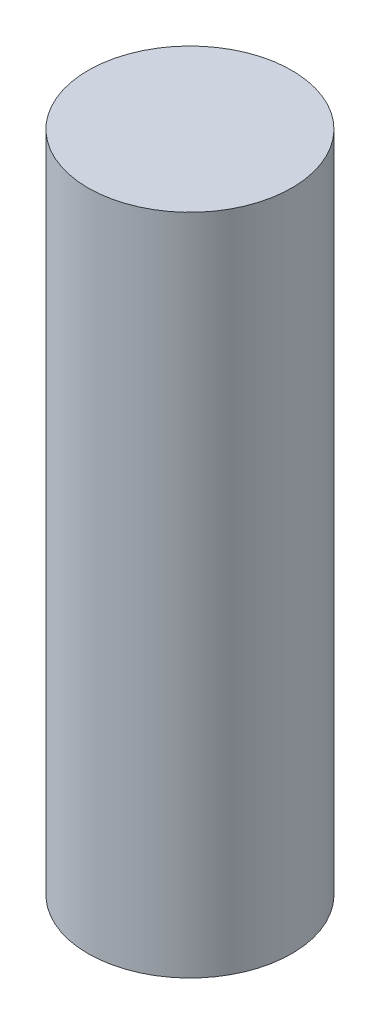
ISO-10303-21;
HEADER;
FILE_DESCRIPTION(('STEP AP214'),'2;1');
FILE_NAME('part.step','',(''),(''),'','','');
FILE_SCHEMA(('AUTOMOTIVE_DESIGN { 1 0 10303 214 1 1 1 1 }'));
ENDSEC;
DATA;
#1=APPLICATION_CONTEXT('core data for automotive mechanical design processes');
#2=APPLICATION_PROTOCOL_DEFINITION('international standard','automotive_design',2000,#1);
#3=PRODUCT_CONTEXT('',#1,'mechanical');
#4=PRODUCT('Part','Part','',(#3));
#5=PRODUCT_RELATED_PRODUCT_CATEGORY('part','',(#4));
#6=PRODUCT_DEFINITION_FORMATION('','',#4);
#7=PRODUCT_DEFINITION_CONTEXT('part definition',#1,'design');
#8=PRODUCT_DEFINITION('design','',#6,#7);
#9=PRODUCT_DEFINITION_SHAPE('','',#8);
#10=(LENGTH_UNIT() NAMED_UNIT(*) SI_UNIT(.MILLI.,.METRE.));
#11=(NAMED_UNIT(*) PLANE_ANGLE_UNIT() SI_UNIT($,.RADIAN.));
#12=(NAMED_UNIT(*) SI_UNIT($,.STERADIAN.) SOLID_ANGLE_UNIT());
#13=UNCERTAINTY_MEASURE_WITH_UNIT(LENGTH_MEASURE(1.E-05),#10,'distance_accuracy_value','');
#14=(GEOMETRIC_REPRESENTATION_CONTEXT(3) GLOBAL_UNCERTAINTY_ASSIGNED_CONTEXT((#13)) GLOBAL_UNIT_ASSIGNED_CONTEXT((#10,
#11,#12)) REPRESENTATION_CONTEXT('',''));
#15=CARTESIAN_POINT('',(0.,0.,0.));
#16=DIRECTION('',(0.,0.,1.));
#17=DIRECTION('',(1.,0.,0.));
#18=AXIS2_PLACEMENT_3D('',#15,#16,#17);
#19=CARTESIAN_POINT('',(0.,70.149974,0.));
#20=DIRECTION('',(0.,-1.,0.));
#21=DIRECTION('',(0.,0.,-1.));
#22=AXIS2_PLACEMENT_3D('',#19,#20,#21);
#23=CYLINDRICAL_SURFACE('',#22,10.7749975);
#24=CARTESIAN_POINT('',(0.,70.149974,0.));
#25=DIRECTION('',(0.,1.,0.));
#26=DIRECTION('',(0.,0.,1.));
#27=AXIS2_PLACEMENT_3D('',#24,#25,#26);
#28=CIRCLE('',#27,10.7749975);
#29=CARTESIAN_POINT('',(0.,70.149974,10.7749975));
#30=VERTEX_POINT('',#29);
#31=EDGE_CURVE('E10',#30,#30,#28,.T.);
#32=ORIENTED_EDGE('',*,*,#31,.F.);
#33=EDGE_LOOP('',(#32));
#34=FACE_BOUND('',#33,.T.);
#35=CARTESIAN_POINT('',(0.,0.,0.));
#36=DIRECTION('',(0.,1.,0.));
#37=DIRECTION('',(0.,0.,1.));
#38=AXIS2_PLACEMENT_3D('',#35,#36,#37);
#39=CIRCLE('',#38,10.7749975);
#40=CARTESIAN_POINT('',(0.,0.,10.7749975));
#41=VERTEX_POINT('',#40);
#42=EDGE_CURVE('E44',#41,#41,#39,.T.);
#43=ORIENTED_EDGE('',*,*,#42,.T.);
#44=EDGE_LOOP('',(#43));
#45=FACE_BOUND('',#44,.T.);
#46=ADVANCED_FACE('F41',(#34,#45),#23,.T.);
#47=CARTESIAN_POINT('',(0.,70.149974,0.));
#48=DIRECTION('',(0.,1.,0.));
#49=DIRECTION('',(0.,0.,1.));
#50=AXIS2_PLACEMENT_3D('',#47,#48,#49);
#51=PLANE('',#50);
#52=ORIENTED_EDGE('',*,*,#31,.T.);
#53=EDGE_LOOP('',(#52));
#54=FACE_BOUND('',#53,.T.);
#55=ADVANCED_FACE('F56',(#54),#51,.T.);
#56=CARTESIAN_POINT('',(0.,0.,0.));
#57=DIRECTION('',(0.,1.,0.));
#58=DIRECTION('',(0.,0.,1.));
#59=AXIS2_PLACEMENT_3D('',#56,#57,#58);
#60=PLANE('',#59);
#61=ORIENTED_EDGE('',*,*,#42,.F.);
#62=EDGE_LOOP('',(#61));
#63=FACE_BOUND('',#62,.T.);
#64=ADVANCED_FACE('F54',(#63),#60,.F.);
#65=CLOSED_SHELL('',(#46,#55,#64));
#66=MANIFOLD_SOLID_BREP('B2',#65);
#67=ADVANCED_BREP_SHAPE_REPRESENTATION('',(#18,#66),#14);
#68=SHAPE_DEFINITION_REPRESENTATION(#9,#67);
ENDSEC;
END-ISO-10303-21;
